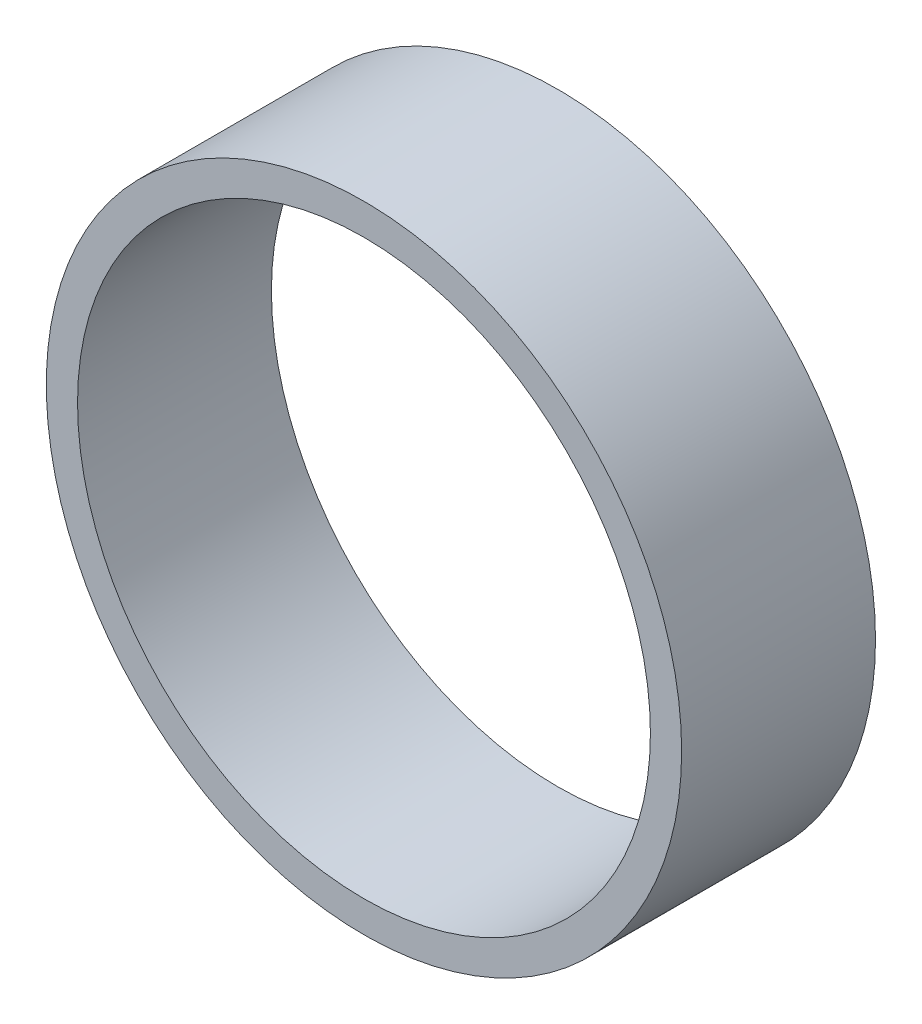
ISO-10303-21;
HEADER;
FILE_DESCRIPTION(('STEP AP214'),'2;1');
FILE_NAME('part.step','',(''),(''),'','','');
FILE_SCHEMA(('AUTOMOTIVE_DESIGN { 1 0 10303 214 1 1 1 1 }'));
ENDSEC;
DATA;
#1=APPLICATION_CONTEXT('core data for automotive mechanical design processes');
#2=APPLICATION_PROTOCOL_DEFINITION('international standard','automotive_design',2000,#1);
#3=PRODUCT_CONTEXT('',#1,'mechanical');
#4=PRODUCT('Part','Part','',(#3));
#5=PRODUCT_RELATED_PRODUCT_CATEGORY('part','',(#4));
#6=PRODUCT_DEFINITION_FORMATION('','',#4);
#7=PRODUCT_DEFINITION_CONTEXT('part definition',#1,'design');
#8=PRODUCT_DEFINITION('design','',#6,#7);
#9=PRODUCT_DEFINITION_SHAPE('','',#8);
#10=(LENGTH_UNIT() NAMED_UNIT(*) SI_UNIT(.MILLI.,.METRE.));
#11=(NAMED_UNIT(*) PLANE_ANGLE_UNIT() SI_UNIT($,.RADIAN.));
#12=(NAMED_UNIT(*) SI_UNIT($,.STERADIAN.) SOLID_ANGLE_UNIT());
#13=UNCERTAINTY_MEASURE_WITH_UNIT(LENGTH_MEASURE(1.E-05),#10,'distance_accuracy_value','');
#14=(GEOMETRIC_REPRESENTATION_CONTEXT(3) GLOBAL_UNCERTAINTY_ASSIGNED_CONTEXT((#13)) GLOBAL_UNIT_ASSIGNED_CONTEXT((#10,
#11,#12)) REPRESENTATION_CONTEXT('',''));
#15=CARTESIAN_POINT('',(0.,0.,0.));
#16=DIRECTION('',(0.,0.,1.));
#17=DIRECTION('',(1.,0.,0.));
#18=AXIS2_PLACEMENT_3D('',#15,#16,#17);
#19=CARTESIAN_POINT('',(0.,25.05,8.47725));
#20=DIRECTION('',(0.,0.,-1.));
#21=DIRECTION('',(-1.,0.,0.));
#22=AXIS2_PLACEMENT_3D('',#19,#20,#21);
#23=PLANE('',#22);
#24=CARTESIAN_POINT('',(0.,0.,8.47725));
#25=DIRECTION('',(0.,0.,1.));
#26=DIRECTION('',(1.,0.,0.));
#27=AXIS2_PLACEMENT_3D('',#24,#25,#26);
#28=CIRCLE('',#27,25.05);
#29=CARTESIAN_POINT('',(25.05,0.,8.47725));
#30=VERTEX_POINT('',#29);
#31=EDGE_CURVE('E46',#30,#30,#28,.T.);
#32=ORIENTED_EDGE('',*,*,#31,.F.);
#33=EDGE_LOOP('',(#32));
#34=FACE_BOUND('',#33,.T.);
#35=CARTESIAN_POINT('',(0.,0.,8.47725));
#36=DIRECTION('',(0.,0.,1.));
#37=DIRECTION('',(1.,0.,0.));
#38=AXIS2_PLACEMENT_3D('',#35,#36,#37);
#39=CIRCLE('',#38,27.78125);
#40=CARTESIAN_POINT('',(27.78125,0.,8.47725));
#41=VERTEX_POINT('',#40);
#42=EDGE_CURVE('E10',#41,#41,#39,.T.);
#43=ORIENTED_EDGE('',*,*,#42,.T.);
#44=EDGE_LOOP('',(#43));
#45=FACE_BOUND('',#44,.T.);
#46=ADVANCED_FACE('F32',(#34,#45),#23,.F.);
#47=CARTESIAN_POINT('',(0.,0.,35.6270308501065));
#48=DIRECTION('',(0.,0.,1.));
#49=DIRECTION('',(1.,0.,0.));
#50=AXIS2_PLACEMENT_3D('',#47,#48,#49);
#51=CYLINDRICAL_SURFACE('',#50,27.78125);
#52=ORIENTED_EDGE('',*,*,#42,.F.);
#53=EDGE_LOOP('',(#52));
#54=FACE_BOUND('',#53,.T.);
#55=CARTESIAN_POINT('',(0.,0.,-8.47725));
#56=DIRECTION('',(0.,0.,1.));
#57=DIRECTION('',(1.,0.,0.));
#58=AXIS2_PLACEMENT_3D('',#55,#56,#57);
#59=CIRCLE('',#58,27.78125);
#60=CARTESIAN_POINT('',(27.78125,0.,-8.47725));
#61=VERTEX_POINT('',#60);
#62=EDGE_CURVE('E38',#61,#61,#59,.T.);
#63=ORIENTED_EDGE('',*,*,#62,.T.);
#64=EDGE_LOOP('',(#63));
#65=FACE_BOUND('',#64,.T.);
#66=ADVANCED_FACE('F55',(#54,#65),#51,.T.);
#67=CARTESIAN_POINT('',(0.,25.05,-8.47725));
#68=DIRECTION('',(0.,0.,1.));
#69=DIRECTION('',(1.,0.,0.));
#70=AXIS2_PLACEMENT_3D('',#67,#68,#69);
#71=PLANE('',#70);
#72=ORIENTED_EDGE('',*,*,#62,.F.);
#73=EDGE_LOOP('',(#72));
#74=FACE_BOUND('',#73,.T.);
#75=CARTESIAN_POINT('',(0.,0.,-8.47725));
#76=DIRECTION('',(0.,0.,1.));
#77=DIRECTION('',(1.,0.,0.));
#78=AXIS2_PLACEMENT_3D('',#75,#76,#77);
#79=CIRCLE('',#78,25.05);
#80=CARTESIAN_POINT('',(25.05,0.,-8.47725));
#81=VERTEX_POINT('',#80);
#82=EDGE_CURVE('E42',#81,#81,#79,.T.);
#83=ORIENTED_EDGE('',*,*,#82,.T.);
#84=EDGE_LOOP('',(#83));
#85=FACE_BOUND('',#84,.T.);
#86=ADVANCED_FACE('F59',(#74,#85),#71,.F.);
#87=CARTESIAN_POINT('',(0.,0.,35.6270308501065));
#88=DIRECTION('',(0.,0.,1.));
#89=DIRECTION('',(1.,0.,0.));
#90=AXIS2_PLACEMENT_3D('',#87,#88,#89);
#91=CYLINDRICAL_SURFACE('',#90,25.05);
#92=ORIENTED_EDGE('',*,*,#82,.F.);
#93=EDGE_LOOP('',(#92));
#94=FACE_BOUND('',#93,.T.);
#95=ORIENTED_EDGE('',*,*,#31,.T.);
#96=EDGE_LOOP('',(#95));
#97=FACE_BOUND('',#96,.T.);
#98=ADVANCED_FACE('F52',(#94,#97),#91,.F.);
#99=CLOSED_SHELL('',(#46,#66,#86,#98));
#100=MANIFOLD_SOLID_BREP('B2',#99);
#101=ADVANCED_BREP_SHAPE_REPRESENTATION('',(#18,#100),#14);
#102=SHAPE_DEFINITION_REPRESENTATION(#9,#101);
ENDSEC;
END-ISO-10303-21;
